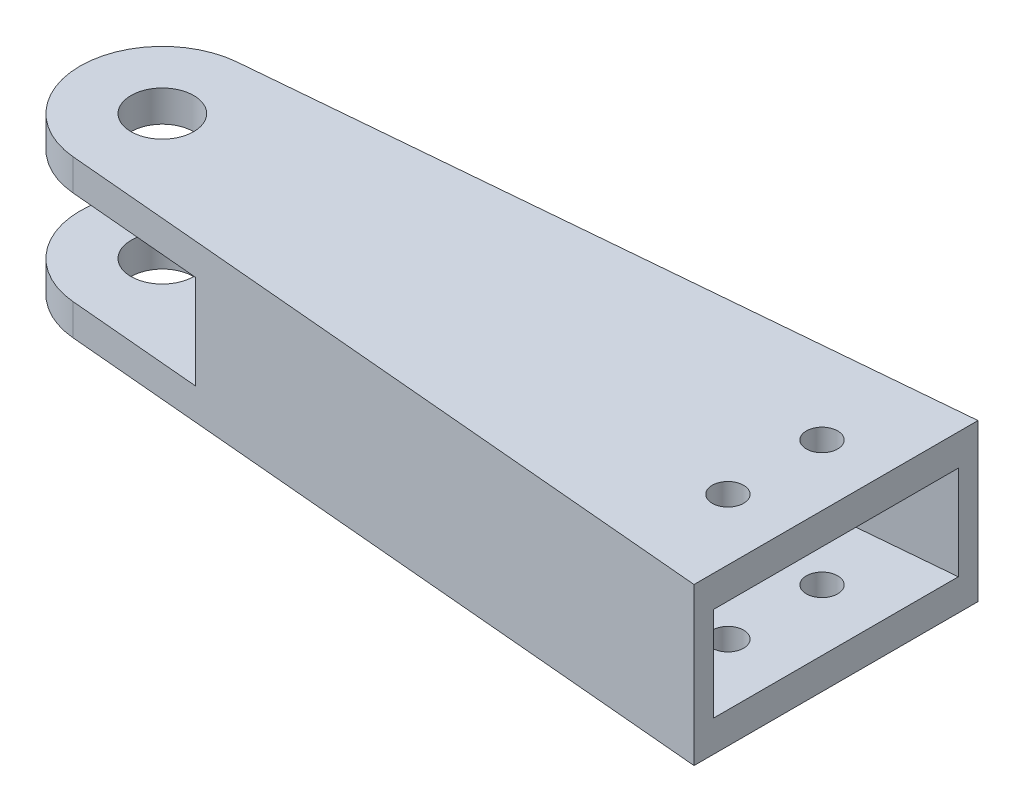
ISO-10303-21;
HEADER;
FILE_DESCRIPTION(('STEP AP214'),'2;1');
FILE_NAME('part.step','',(''),(''),'','','');
FILE_SCHEMA(('AUTOMOTIVE_DESIGN { 1 0 10303 214 1 1 1 1 }'));
ENDSEC;
DATA;
#1=APPLICATION_CONTEXT('core data for automotive mechanical design processes');
#2=APPLICATION_PROTOCOL_DEFINITION('international standard','automotive_design',2000,#1);
#3=PRODUCT_CONTEXT('',#1,'mechanical');
#4=PRODUCT('Part','Part','',(#3));
#5=PRODUCT_RELATED_PRODUCT_CATEGORY('part','',(#4));
#6=PRODUCT_DEFINITION_FORMATION('','',#4);
#7=PRODUCT_DEFINITION_CONTEXT('part definition',#1,'design');
#8=PRODUCT_DEFINITION('design','',#6,#7);
#9=PRODUCT_DEFINITION_SHAPE('','',#8);
#10=(LENGTH_UNIT() NAMED_UNIT(*) SI_UNIT(.MILLI.,.METRE.));
#11=(NAMED_UNIT(*) PLANE_ANGLE_UNIT() SI_UNIT($,.RADIAN.));
#12=(NAMED_UNIT(*) SI_UNIT($,.STERADIAN.) SOLID_ANGLE_UNIT());
#13=UNCERTAINTY_MEASURE_WITH_UNIT(LENGTH_MEASURE(1.E-05),#10,'distance_accuracy_value','');
#14=(GEOMETRIC_REPRESENTATION_CONTEXT(3) GLOBAL_UNCERTAINTY_ASSIGNED_CONTEXT((#13)) GLOBAL_UNIT_ASSIGNED_CONTEXT((#10,
#11,#12)) REPRESENTATION_CONTEXT('',''));
#15=CARTESIAN_POINT('',(0.,0.,0.));
#16=DIRECTION('',(0.,0.,1.));
#17=DIRECTION('',(1.,0.,0.));
#18=AXIS2_PLACEMENT_3D('',#15,#16,#17);
#19=CARTESIAN_POINT('',(-160.9,16.,0.));
#20=DIRECTION('',(0.,1.,0.));
#21=DIRECTION('',(0.,0.,1.));
#22=AXIS2_PLACEMENT_3D('',#19,#20,#21);
#23=PLANE('',#22);
#24=CARTESIAN_POINT('',(-160.9,16.,0.));
#25=DIRECTION('',(0.,1.,0.));
#26=DIRECTION('',(0.,0.,1.));
#27=AXIS2_PLACEMENT_3D('',#24,#25,#26);
#28=CIRCLE('',#27,3.99999999999999);
#29=CARTESIAN_POINT('',(-160.9,16.,3.99999999999999));
#30=VERTEX_POINT('',#29);
#31=EDGE_CURVE('E353',#30,#30,#28,.T.);
#32=ORIENTED_EDGE('',*,*,#31,.T.);
#33=EDGE_LOOP('',(#32));
#34=FACE_BOUND('',#33,.T.);
#35=DIRECTION('',(-0.0877327517225691,0.,-0.996144047954505));
#36=VECTOR('',#35,1.);
#37=CARTESIAN_POINT('',(-144.730083356816,16.,-11.9647668494372));
#38=LINE('',#37,#36);
#39=CARTESIAN_POINT('',(-144.510751477509,16.,-9.47440672955096));
#40=VERTEX_POINT('',#39);
#41=CARTESIAN_POINT('',(-144.730083356816,16.,-11.9647668494372));
#42=VERTEX_POINT('',#41);
#43=EDGE_CURVE('E138',#40,#42,#38,.T.);
#44=ORIENTED_EDGE('',*,*,#43,.F.);
#45=DIRECTION('',(0.,0.,-1.));
#46=VECTOR('',#45,1.);
#47=CARTESIAN_POINT('',(-144.510751477509,16.,-9.47440672955096));
#48=LINE('',#47,#46);
#49=CARTESIAN_POINT('',(-144.51075147751,16.,9.47440672955096));
#50=VERTEX_POINT('',#49);
#51=EDGE_CURVE('E156',#50,#40,#48,.T.);
#52=ORIENTED_EDGE('',*,*,#51,.F.);
#53=DIRECTION('',(0.0877327517224724,0.,-0.996144047954513));
#54=VECTOR('',#53,1.);
#55=CARTESIAN_POINT('',(-144.51075147751,16.,9.47440672955096));
#56=LINE('',#55,#54);
#57=CARTESIAN_POINT('',(-144.730083356816,16.,11.9647668494372));
#58=VERTEX_POINT('',#57);
#59=EDGE_CURVE('E251',#58,#50,#56,.T.);
#60=ORIENTED_EDGE('',*,*,#59,.F.);
#61=DIRECTION('',(0.996144047954509,0.,0.087732751722518));
#62=VECTOR('',#61,1.);
#63=CARTESIAN_POINT('',(-161.821193893087,16.,10.4595125035224));
#64=LINE('',#63,#62);
#65=CARTESIAN_POINT('',(-161.821193893087,16.,10.4595125035224));
#66=VERTEX_POINT('',#65);
#67=EDGE_CURVE('E146',#66,#58,#64,.T.);
#68=ORIENTED_EDGE('',*,*,#67,.F.);
#69=CARTESIAN_POINT('',(-160.9,16.,0.));
#70=DIRECTION('',(0.,1.,0.));
#71=DIRECTION('',(0.,0.,1.));
#72=AXIS2_PLACEMENT_3D('',#69,#70,#71);
#73=CIRCLE('',#72,10.5);
#74=CARTESIAN_POINT('',(-161.821193893087,16.,-10.4595125035224));
#75=VERTEX_POINT('',#74);
#76=EDGE_CURVE('E142',#75,#66,#73,.T.);
#77=ORIENTED_EDGE('',*,*,#76,.F.);
#78=DIRECTION('',(-0.996144047954509,0.,0.0877327517225174));
#79=VECTOR('',#78,1.);
#80=CARTESIAN_POINT('',(-75.,16.,-18.1060594700135));
#81=LINE('',#80,#79);
#82=EDGE_CURVE('E136',#42,#75,#81,.T.);
#83=ORIENTED_EDGE('',*,*,#82,.F.);
#84=EDGE_LOOP('',(#44,#52,#60,#68,#77,#83));
#85=FACE_BOUND('',#84,.T.);
#86=ADVANCED_FACE('F35',(#34,#85),#23,.F.);
#87=CARTESIAN_POINT('',(-161.821193893087,16.,10.4595125035224));
#88=DIRECTION('',(-0.087732751722518,0.,0.996144047954509));
#89=DIRECTION('',(0.996144047954509,0.,0.087732751722518));
#90=AXIS2_PLACEMENT_3D('',#87,#88,#89);
#91=PLANE('',#90);
#92=DIRECTION('',(0.996144047954509,0.,0.087732751722518));
#93=VECTOR('',#92,1.);
#94=CARTESIAN_POINT('',(-161.821193893087,20.,10.4595125035224));
#95=LINE('',#94,#93);
#96=CARTESIAN_POINT('',(-161.821193893087,20.,10.4595125035224));
#97=VERTEX_POINT('',#96);
#98=CARTESIAN_POINT('',(-75.,20.,18.1060594700135));
#99=VERTEX_POINT('',#98);
#100=EDGE_CURVE('E177',#97,#99,#95,.T.);
#101=ORIENTED_EDGE('',*,*,#100,.F.);
#102=DIRECTION('',(0.,1.,0.));
#103=VECTOR('',#102,1.);
#104=CARTESIAN_POINT('',(-161.821193893087,16.,10.4595125035224));
#105=LINE('',#104,#103);
#106=EDGE_CURVE('E11',#66,#97,#105,.T.);
#107=ORIENTED_EDGE('',*,*,#106,.F.);
#108=ORIENTED_EDGE('',*,*,#67,.T.);
#109=DIRECTION('',(0.,1.,0.));
#110=VECTOR('',#109,1.);
#111=CARTESIAN_POINT('',(-144.730083356815,4.,11.9647668494337));
#112=LINE('',#111,#110);
#113=CARTESIAN_POINT('',(-144.730083356815,4.,11.9647668494337));
#114=VERTEX_POINT('',#113);
#115=EDGE_CURVE('E174',#114,#58,#112,.T.);
#116=ORIENTED_EDGE('',*,*,#115,.F.);
#117=DIRECTION('',(-0.996144047954509,0.,-0.087732751722518));
#118=VECTOR('',#117,1.);
#119=CARTESIAN_POINT('',(-161.821193893087,3.99999999999999,10.4595125035224));
#120=LINE('',#119,#118);
#121=CARTESIAN_POINT('',(-161.821193893087,3.99999999999999,10.4595125035224));
#122=VERTEX_POINT('',#121);
#123=EDGE_CURVE('E205',#114,#122,#120,.T.);
#124=ORIENTED_EDGE('',*,*,#123,.T.);
#125=DIRECTION('',(0.,1.,0.));
#126=VECTOR('',#125,1.);
#127=CARTESIAN_POINT('',(-161.821193893087,0.,10.4595125035224));
#128=LINE('',#127,#126);
#129=CARTESIAN_POINT('',(-161.821193893087,0.,10.4595125035224));
#130=VERTEX_POINT('',#129);
#131=EDGE_CURVE('E248',#130,#122,#128,.T.);
#132=ORIENTED_EDGE('',*,*,#131,.F.);
#133=DIRECTION('',(-0.996144047954509,0.,-0.087732751722518));
#134=VECTOR('',#133,1.);
#135=CARTESIAN_POINT('',(-161.821193893087,0.,10.4595125035224));
#136=LINE('',#135,#134);
#137=CARTESIAN_POINT('',(-75.,0.,18.1060594700135));
#138=VERTEX_POINT('',#137);
#139=EDGE_CURVE('E235',#138,#130,#136,.T.);
#140=ORIENTED_EDGE('',*,*,#139,.F.);
#141=DIRECTION('',(0.,1.,0.));
#142=VECTOR('',#141,1.);
#143=CARTESIAN_POINT('',(-75.,16.,18.1060594700135));
#144=LINE('',#143,#142);
#145=EDGE_CURVE('E182',#138,#99,#144,.T.);
#146=ORIENTED_EDGE('',*,*,#145,.T.);
#147=EDGE_LOOP('',(#101,#107,#108,#116,#124,#132,#140,#146));
#148=FACE_BOUND('',#147,.T.);
#149=ADVANCED_FACE('F266',(#148),#91,.T.);
#150=CARTESIAN_POINT('',(-160.9,16.,0.));
#151=DIRECTION('',(0.,1.,0.));
#152=DIRECTION('',(0.,0.,1.));
#153=AXIS2_PLACEMENT_3D('',#150,#151,#152);
#154=CYLINDRICAL_SURFACE('',#153,10.5);
#155=CARTESIAN_POINT('',(-160.9,20.,0.));
#156=DIRECTION('',(0.,1.,0.));
#157=DIRECTION('',(0.,0.,1.));
#158=AXIS2_PLACEMENT_3D('',#155,#156,#157);
#159=CIRCLE('',#158,10.5);
#160=CARTESIAN_POINT('',(-161.821193893087,20.,-10.4595125035224));
#161=VERTEX_POINT('',#160);
#162=EDGE_CURVE('E179',#161,#97,#159,.T.);
#163=ORIENTED_EDGE('',*,*,#162,.F.);
#164=DIRECTION('',(0.,1.,0.));
#165=VECTOR('',#164,1.);
#166=CARTESIAN_POINT('',(-161.821193893087,16.,-10.4595125035224));
#167=LINE('',#166,#165);
#168=EDGE_CURVE('E45',#75,#161,#167,.T.);
#169=ORIENTED_EDGE('',*,*,#168,.F.);
#170=ORIENTED_EDGE('',*,*,#76,.T.);
#171=ORIENTED_EDGE('',*,*,#106,.T.);
#172=EDGE_LOOP('',(#163,#169,#170,#171));
#173=FACE_BOUND('',#172,.T.);
#174=ADVANCED_FACE('F270',(#173),#154,.T.);
#175=CARTESIAN_POINT('',(-75.,16.,-18.1060594700135));
#176=DIRECTION('',(-0.0877327517225175,0.,-0.996144047954509));
#177=DIRECTION('',(-0.996144047954509,0.,0.0877327517225175));
#178=AXIS2_PLACEMENT_3D('',#175,#176,#177);
#179=PLANE('',#178);
#180=DIRECTION('',(-0.996144047954509,0.,0.0877327517225174));
#181=VECTOR('',#180,1.);
#182=CARTESIAN_POINT('',(-75.,20.,-18.1060594700135));
#183=LINE('',#182,#181);
#184=CARTESIAN_POINT('',(-75.,20.,-18.1060594700135));
#185=VERTEX_POINT('',#184);
#186=EDGE_CURVE('E188',#185,#161,#183,.T.);
#187=ORIENTED_EDGE('',*,*,#186,.F.);
#188=DIRECTION('',(0.,1.,0.));
#189=VECTOR('',#188,1.);
#190=CARTESIAN_POINT('',(-75.,16.,-18.1060594700135));
#191=LINE('',#190,#189);
#192=CARTESIAN_POINT('',(-75.,0.,-18.1060594700135));
#193=VERTEX_POINT('',#192);
#194=EDGE_CURVE('E194',#193,#185,#191,.T.);
#195=ORIENTED_EDGE('',*,*,#194,.F.);
#196=DIRECTION('',(0.996144047954509,0.,-0.0877327517225174));
#197=VECTOR('',#196,1.);
#198=CARTESIAN_POINT('',(-75.,0.,-18.1060594700135));
#199=LINE('',#198,#197);
#200=CARTESIAN_POINT('',(-161.821193893087,0.,-10.4595125035224));
#201=VERTEX_POINT('',#200);
#202=EDGE_CURVE('E239',#201,#193,#199,.T.);
#203=ORIENTED_EDGE('',*,*,#202,.F.);
#204=DIRECTION('',(0.,1.,0.));
#205=VECTOR('',#204,1.);
#206=CARTESIAN_POINT('',(-161.821193893087,0.,-10.4595125035224));
#207=LINE('',#206,#205);
#208=CARTESIAN_POINT('',(-161.821193893087,3.99999999999999,-10.4595125035224));
#209=VERTEX_POINT('',#208);
#210=EDGE_CURVE('E242',#201,#209,#207,.T.);
#211=ORIENTED_EDGE('',*,*,#210,.T.);
#212=DIRECTION('',(0.996144047954509,0.,-0.0877327517225174));
#213=VECTOR('',#212,1.);
#214=CARTESIAN_POINT('',(-75.,3.99999999999999,-18.1060594700135));
#215=LINE('',#214,#213);
#216=CARTESIAN_POINT('',(-144.730083356816,3.99999999999999,-11.9647668494372));
#217=VERTEX_POINT('',#216);
#218=EDGE_CURVE('E163',#209,#217,#215,.T.);
#219=ORIENTED_EDGE('',*,*,#218,.T.);
#220=DIRECTION('',(0.,1.,0.));
#221=VECTOR('',#220,1.);
#222=CARTESIAN_POINT('',(-144.730083356816,4.,-11.9647668494372));
#223=LINE('',#222,#221);
#224=EDGE_CURVE('E152',#217,#42,#223,.T.);
#225=ORIENTED_EDGE('',*,*,#224,.T.);
#226=ORIENTED_EDGE('',*,*,#82,.T.);
#227=ORIENTED_EDGE('',*,*,#168,.T.);
#228=EDGE_LOOP('',(#187,#195,#203,#211,#219,#225,#226,#227));
#229=FACE_BOUND('',#228,.T.);
#230=ADVANCED_FACE('F160',(#229),#179,.T.);
#231=CARTESIAN_POINT('',(-75.,16.,18.1060594700135));
#232=DIRECTION('',(1.,0.,0.));
#233=DIRECTION('',(0.,0.,-1.));
#234=AXIS2_PLACEMENT_3D('',#231,#232,#233);
#235=PLANE('',#234);
#236=DIRECTION('',(0.,0.,-1.));
#237=VECTOR('',#236,1.);
#238=CARTESIAN_POINT('',(-75.,4.,15.5963822751002));
#239=LINE('',#238,#237);
#240=CARTESIAN_POINT('',(-75.,4.,15.5963822751002));
#241=VERTEX_POINT('',#240);
#242=CARTESIAN_POINT('',(-75.,4.,-15.5963822751002));
#243=VERTEX_POINT('',#242);
#244=EDGE_CURVE('E54',#241,#243,#239,.T.);
#245=ORIENTED_EDGE('',*,*,#244,.F.);
#246=DIRECTION('',(0.,-1.,0.));
#247=VECTOR('',#246,1.);
#248=CARTESIAN_POINT('',(-75.,16.,15.5963822751002));
#249=LINE('',#248,#247);
#250=CARTESIAN_POINT('',(-75.,16.,15.5963822751002));
#251=VERTEX_POINT('',#250);
#252=EDGE_CURVE('E227',#251,#241,#249,.T.);
#253=ORIENTED_EDGE('',*,*,#252,.F.);
#254=DIRECTION('',(0.,0.,1.));
#255=VECTOR('',#254,1.);
#256=CARTESIAN_POINT('',(-75.,16.,-15.5963822751002));
#257=LINE('',#256,#255);
#258=CARTESIAN_POINT('',(-75.,16.,-15.5963822751002));
#259=VERTEX_POINT('',#258);
#260=EDGE_CURVE('E217',#259,#251,#257,.T.);
#261=ORIENTED_EDGE('',*,*,#260,.F.);
#262=DIRECTION('',(0.,1.,0.));
#263=VECTOR('',#262,1.);
#264=CARTESIAN_POINT('',(-75.,4.,-15.5963822751002));
#265=LINE('',#264,#263);
#266=EDGE_CURVE('E222',#243,#259,#265,.T.);
#267=ORIENTED_EDGE('',*,*,#266,.F.);
#268=EDGE_LOOP('',(#245,#253,#261,#267));
#269=FACE_BOUND('',#268,.T.);
#270=DIRECTION('',(0.,0.,-1.));
#271=VECTOR('',#270,1.);
#272=CARTESIAN_POINT('',(-75.,20.,18.1060594700135));
#273=LINE('',#272,#271);
#274=EDGE_CURVE('E185',#99,#185,#273,.T.);
#275=ORIENTED_EDGE('',*,*,#274,.F.);
#276=ORIENTED_EDGE('',*,*,#145,.F.);
#277=DIRECTION('',(0.,0.,1.));
#278=VECTOR('',#277,1.);
#279=CARTESIAN_POINT('',(-75.,0.,18.1060594700135));
#280=LINE('',#279,#278);
#281=EDGE_CURVE('E232',#193,#138,#280,.T.);
#282=ORIENTED_EDGE('',*,*,#281,.F.);
#283=ORIENTED_EDGE('',*,*,#194,.T.);
#284=EDGE_LOOP('',(#275,#276,#282,#283));
#285=FACE_BOUND('',#284,.T.);
#286=ADVANCED_FACE('F225',(#269,#285),#235,.T.);
#287=CARTESIAN_POINT('',(-160.9,20.,0.));
#288=DIRECTION('',(0.,1.,0.));
#289=DIRECTION('',(0.,0.,1.));
#290=AXIS2_PLACEMENT_3D('',#287,#288,#289);
#291=PLANE('',#290);
#292=CARTESIAN_POINT('',(-160.9,20.,0.));
#293=DIRECTION('',(0.,1.,0.));
#294=DIRECTION('',(0.,0.,1.));
#295=AXIS2_PLACEMENT_3D('',#292,#293,#294);
#296=CIRCLE('',#295,3.99999999999998);
#297=CARTESIAN_POINT('',(-160.9,20.,3.99999999999998));
#298=VERTEX_POINT('',#297);
#299=EDGE_CURVE('E355',#298,#298,#296,.T.);
#300=ORIENTED_EDGE('',*,*,#299,.F.);
#301=EDGE_LOOP('',(#300));
#302=FACE_BOUND('',#301,.T.);
#303=CARTESIAN_POINT('',(-82.7999999999479,20.,-6.01761447089224));
#304=DIRECTION('',(0.,1.,0.));
#305=DIRECTION('',(0.,0.,1.));
#306=AXIS2_PLACEMENT_3D('',#303,#304,#305);
#307=CIRCLE('',#306,1.99999999999999);
#308=CARTESIAN_POINT('',(-82.7999999999479,20.,-4.01761447089225));
#309=VERTEX_POINT('',#308);
#310=EDGE_CURVE('E350',#309,#309,#307,.T.);
#311=ORIENTED_EDGE('',*,*,#310,.F.);
#312=EDGE_LOOP('',(#311));
#313=FACE_BOUND('',#312,.T.);
#314=CARTESIAN_POINT('',(-82.7999999999479,20.,5.98238552910776));
#315=DIRECTION('',(0.,1.,0.));
#316=DIRECTION('',(0.,0.,1.));
#317=AXIS2_PLACEMENT_3D('',#314,#315,#316);
#318=CIRCLE('',#317,1.99999999999999);
#319=CARTESIAN_POINT('',(-82.7999999999479,20.,7.98238552910775));
#320=VERTEX_POINT('',#319);
#321=EDGE_CURVE('E347',#320,#320,#318,.T.);
#322=ORIENTED_EDGE('',*,*,#321,.F.);
#323=EDGE_LOOP('',(#322));
#324=FACE_BOUND('',#323,.T.);
#325=ORIENTED_EDGE('',*,*,#100,.T.);
#326=ORIENTED_EDGE('',*,*,#274,.T.);
#327=ORIENTED_EDGE('',*,*,#186,.T.);
#328=ORIENTED_EDGE('',*,*,#162,.T.);
#329=EDGE_LOOP('',(#325,#326,#327,#328));
#330=FACE_BOUND('',#329,.T.);
#331=ADVANCED_FACE('F272',(#302,#313,#324,#330),#291,.T.);
#332=CARTESIAN_POINT('',(-144.51075147751,4.,9.47440672955096));
#333=DIRECTION('',(0.996144047954513,0.,0.0877327517224724));
#334=DIRECTION('',(0.0877327517224724,0.,-0.996144047954513));
#335=AXIS2_PLACEMENT_3D('',#332,#333,#334);
#336=PLANE('',#335);
#337=ORIENTED_EDGE('',*,*,#59,.T.);
#338=DIRECTION('',(0.,1.,0.));
#339=VECTOR('',#338,1.);
#340=CARTESIAN_POINT('',(-144.51075147751,4.,9.47440672955096));
#341=LINE('',#340,#339);
#342=CARTESIAN_POINT('',(-144.51075147751,4.,9.47440672955096));
#343=VERTEX_POINT('',#342);
#344=EDGE_CURVE('E166',#343,#50,#341,.T.);
#345=ORIENTED_EDGE('',*,*,#344,.F.);
#346=DIRECTION('',(0.0877327517224724,0.,-0.996144047954513));
#347=VECTOR('',#346,1.);
#348=CARTESIAN_POINT('',(-144.51075147751,4.,9.47440672955096));
#349=LINE('',#348,#347);
#350=EDGE_CURVE('E155',#114,#343,#349,.T.);
#351=ORIENTED_EDGE('',*,*,#350,.F.);
#352=ORIENTED_EDGE('',*,*,#115,.T.);
#353=EDGE_LOOP('',(#337,#345,#351,#352));
#354=FACE_BOUND('',#353,.T.);
#355=ADVANCED_FACE('F261',(#354),#336,.F.);
#356=CARTESIAN_POINT('',(-144.510751477509,4.,-9.47440672955096));
#357=DIRECTION('',(1.,0.,0.));
#358=DIRECTION('',(0.,0.,-1.));
#359=AXIS2_PLACEMENT_3D('',#356,#357,#358);
#360=PLANE('',#359);
#361=ORIENTED_EDGE('',*,*,#51,.T.);
#362=DIRECTION('',(0.,1.,0.));
#363=VECTOR('',#362,1.);
#364=CARTESIAN_POINT('',(-144.510751477509,4.,-9.47440672955096));
#365=LINE('',#364,#363);
#366=CARTESIAN_POINT('',(-144.510751477509,4.,-9.47440672955096));
#367=VERTEX_POINT('',#366);
#368=EDGE_CURVE('E154',#367,#40,#365,.T.);
#369=ORIENTED_EDGE('',*,*,#368,.F.);
#370=DIRECTION('',(0.,0.,-1.));
#371=VECTOR('',#370,1.);
#372=CARTESIAN_POINT('',(-144.510751477509,4.,-9.47440672955096));
#373=LINE('',#372,#371);
#374=EDGE_CURVE('E168',#343,#367,#373,.T.);
#375=ORIENTED_EDGE('',*,*,#374,.F.);
#376=ORIENTED_EDGE('',*,*,#344,.T.);
#377=EDGE_LOOP('',(#361,#369,#375,#376));
#378=FACE_BOUND('',#377,.T.);
#379=ADVANCED_FACE('F258',(#378),#360,.F.);
#380=CARTESIAN_POINT('',(-144.730083356816,4.,-11.9647668494372));
#381=DIRECTION('',(0.996144047954505,0.,-0.087732751722569));
#382=DIRECTION('',(-0.087732751722569,0.,-0.996144047954505));
#383=AXIS2_PLACEMENT_3D('',#380,#381,#382);
#384=PLANE('',#383);
#385=ORIENTED_EDGE('',*,*,#43,.T.);
#386=ORIENTED_EDGE('',*,*,#224,.F.);
#387=DIRECTION('',(-0.0877327517225691,0.,-0.996144047954505));
#388=VECTOR('',#387,1.);
#389=CARTESIAN_POINT('',(-144.730083356816,4.,-11.9647668494372));
#390=LINE('',#389,#388);
#391=EDGE_CURVE('E164',#367,#217,#390,.T.);
#392=ORIENTED_EDGE('',*,*,#391,.F.);
#393=ORIENTED_EDGE('',*,*,#368,.T.);
#394=EDGE_LOOP('',(#385,#386,#392,#393));
#395=FACE_BOUND('',#394,.T.);
#396=ADVANCED_FACE('F150',(#395),#384,.F.);
#397=CARTESIAN_POINT('',(-160.9,0.,0.));
#398=DIRECTION('',(0.,1.,0.));
#399=DIRECTION('',(0.,0.,1.));
#400=AXIS2_PLACEMENT_3D('',#397,#398,#399);
#401=CYLINDRICAL_SURFACE('',#400,10.5);
#402=CARTESIAN_POINT('',(-160.9,3.99999999999999,0.));
#403=DIRECTION('',(0.,-1.,0.));
#404=DIRECTION('',(0.,0.,1.));
#405=AXIS2_PLACEMENT_3D('',#402,#403,#404);
#406=CIRCLE('',#405,10.5);
#407=EDGE_CURVE('E244',#122,#209,#406,.T.);
#408=ORIENTED_EDGE('',*,*,#407,.T.);
#409=ORIENTED_EDGE('',*,*,#210,.F.);
#410=CARTESIAN_POINT('',(-160.9,0.,0.));
#411=DIRECTION('',(0.,-1.,0.));
#412=DIRECTION('',(0.,0.,1.));
#413=AXIS2_PLACEMENT_3D('',#410,#411,#412);
#414=CIRCLE('',#413,10.5);
#415=EDGE_CURVE('E237',#130,#201,#414,.T.);
#416=ORIENTED_EDGE('',*,*,#415,.F.);
#417=ORIENTED_EDGE('',*,*,#131,.T.);
#418=EDGE_LOOP('',(#408,#409,#416,#417));
#419=FACE_BOUND('',#418,.T.);
#420=ADVANCED_FACE('F282',(#419),#401,.T.);
#421=CARTESIAN_POINT('',(-160.9,0.,0.));
#422=DIRECTION('',(0.,1.,0.));
#423=DIRECTION('',(0.,0.,1.));
#424=AXIS2_PLACEMENT_3D('',#421,#422,#423);
#425=PLANE('',#424);
#426=CARTESIAN_POINT('',(-160.9,0.,0.));
#427=DIRECTION('',(0.,1.,0.));
#428=DIRECTION('',(0.,0.,1.));
#429=AXIS2_PLACEMENT_3D('',#426,#427,#428);
#430=CIRCLE('',#429,3.99999999999998);
#431=CARTESIAN_POINT('',(-160.9,0.,3.99999999999998));
#432=VERTEX_POINT('',#431);
#433=EDGE_CURVE('E358',#432,#432,#430,.T.);
#434=ORIENTED_EDGE('',*,*,#433,.T.);
#435=EDGE_LOOP('',(#434));
#436=FACE_BOUND('',#435,.T.);
#437=CARTESIAN_POINT('',(-82.7999999999479,0.,-6.01761447089224));
#438=DIRECTION('',(0.,1.,0.));
#439=DIRECTION('',(0.,0.,1.));
#440=AXIS2_PLACEMENT_3D('',#437,#438,#439);
#441=CIRCLE('',#440,1.99999999999999);
#442=CARTESIAN_POINT('',(-82.7999999999479,0.,-4.01761447089225));
#443=VERTEX_POINT('',#442);
#444=EDGE_CURVE('E338',#443,#443,#441,.T.);
#445=ORIENTED_EDGE('',*,*,#444,.T.);
#446=EDGE_LOOP('',(#445));
#447=FACE_BOUND('',#446,.T.);
#448=CARTESIAN_POINT('',(-82.7999999999479,0.,5.98238552910776));
#449=DIRECTION('',(0.,1.,0.));
#450=DIRECTION('',(0.,0.,1.));
#451=AXIS2_PLACEMENT_3D('',#448,#449,#450);
#452=CIRCLE('',#451,1.99999999999999);
#453=CARTESIAN_POINT('',(-82.7999999999479,0.,7.98238552910775));
#454=VERTEX_POINT('',#453);
#455=EDGE_CURVE('E328',#454,#454,#452,.T.);
#456=ORIENTED_EDGE('',*,*,#455,.T.);
#457=EDGE_LOOP('',(#456));
#458=FACE_BOUND('',#457,.T.);
#459=ORIENTED_EDGE('',*,*,#281,.T.);
#460=ORIENTED_EDGE('',*,*,#139,.T.);
#461=ORIENTED_EDGE('',*,*,#415,.T.);
#462=ORIENTED_EDGE('',*,*,#202,.T.);
#463=EDGE_LOOP('',(#459,#460,#461,#462));
#464=FACE_BOUND('',#463,.T.);
#465=ADVANCED_FACE('F278',(#436,#447,#458,#464),#425,.F.);
#466=CARTESIAN_POINT('',(-160.9,3.99999999999999,0.));
#467=DIRECTION('',(0.,1.,0.));
#468=DIRECTION('',(0.,0.,1.));
#469=AXIS2_PLACEMENT_3D('',#466,#467,#468);
#470=PLANE('',#469);
#471=CARTESIAN_POINT('',(-160.9,3.99999999999999,0.));
#472=DIRECTION('',(0.,1.,0.));
#473=DIRECTION('',(0.,0.,1.));
#474=AXIS2_PLACEMENT_3D('',#471,#472,#473);
#475=CIRCLE('',#474,3.99999999999998);
#476=CARTESIAN_POINT('',(-160.9,3.99999999999999,3.99999999999998));
#477=VERTEX_POINT('',#476);
#478=EDGE_CURVE('E361',#477,#477,#475,.T.);
#479=ORIENTED_EDGE('',*,*,#478,.F.);
#480=EDGE_LOOP('',(#479));
#481=FACE_BOUND('',#480,.T.);
#482=ORIENTED_EDGE('',*,*,#123,.F.);
#483=ORIENTED_EDGE('',*,*,#350,.T.);
#484=ORIENTED_EDGE('',*,*,#374,.T.);
#485=ORIENTED_EDGE('',*,*,#391,.T.);
#486=ORIENTED_EDGE('',*,*,#218,.F.);
#487=ORIENTED_EDGE('',*,*,#407,.F.);
#488=EDGE_LOOP('',(#482,#483,#484,#485,#486,#487));
#489=FACE_BOUND('',#488,.T.);
#490=ADVANCED_FACE('F285',(#481,#489),#470,.T.);
#491=CARTESIAN_POINT('',(-95.,4.,15.5963822751002));
#492=DIRECTION('',(0.,-1.,0.));
#493=DIRECTION('',(0.,0.,-1.));
#494=AXIS2_PLACEMENT_3D('',#491,#492,#493);
#495=PLANE('',#494);
#496=CARTESIAN_POINT('',(-82.7999999999479,4.,-6.01761447089224));
#497=DIRECTION('',(0.,1.,0.));
#498=DIRECTION('',(0.,0.,1.));
#499=AXIS2_PLACEMENT_3D('',#496,#497,#498);
#500=CIRCLE('',#499,1.99999999999999);
#501=CARTESIAN_POINT('',(-82.7999999999479,4.,-4.01761447089225));
#502=VERTEX_POINT('',#501);
#503=EDGE_CURVE('E341',#502,#502,#500,.T.);
#504=ORIENTED_EDGE('',*,*,#503,.F.);
#505=EDGE_LOOP('',(#504));
#506=FACE_BOUND('',#505,.T.);
#507=CARTESIAN_POINT('',(-82.7999999999479,4.,5.98238552910776));
#508=DIRECTION('',(0.,1.,0.));
#509=DIRECTION('',(0.,0.,1.));
#510=AXIS2_PLACEMENT_3D('',#507,#508,#509);
#511=CIRCLE('',#510,1.99999999999999);
#512=CARTESIAN_POINT('',(-82.7999999999479,4.,7.98238552910775));
#513=VERTEX_POINT('',#512);
#514=EDGE_CURVE('E330',#513,#513,#511,.T.);
#515=ORIENTED_EDGE('',*,*,#514,.F.);
#516=EDGE_LOOP('',(#515));
#517=FACE_BOUND('',#516,.T.);
#518=ORIENTED_EDGE('',*,*,#244,.T.);
#519=DIRECTION('',(-0.996144047954509,0.,0.0877327517225213));
#520=VECTOR('',#519,1.);
#521=CARTESIAN_POINT('',(-97.5721340505858,4.,-13.6084012832207));
#522=LINE('',#521,#520);
#523=CARTESIAN_POINT('',(-95.,4.,-13.8349351851402));
#524=VERTEX_POINT('',#523);
#525=EDGE_CURVE('E70',#524,#243,#522,.F.);
#526=ORIENTED_EDGE('',*,*,#525,.F.);
#527=DIRECTION('',(0.,0.,-1.));
#528=VECTOR('',#527,1.);
#529=CARTESIAN_POINT('',(-95.,4.,15.5963822751002));
#530=LINE('',#529,#528);
#531=CARTESIAN_POINT('',(-95.,4.,13.8349351851402));
#532=VERTEX_POINT('',#531);
#533=EDGE_CURVE('E209',#532,#524,#530,.T.);
#534=ORIENTED_EDGE('',*,*,#533,.F.);
#535=DIRECTION('',(-0.996144047954509,0.,-0.0877327517225213));
#536=VECTOR('',#535,1.);
#537=CARTESIAN_POINT('',(-75.,4.,15.5963822751002));
#538=LINE('',#537,#536);
#539=EDGE_CURVE('E75',#532,#241,#538,.F.);
#540=ORIENTED_EDGE('',*,*,#539,.T.);
#541=EDGE_LOOP('',(#518,#526,#534,#540));
#542=FACE_BOUND('',#541,.T.);
#543=ADVANCED_FACE('F287',(#506,#517,#542),#495,.F.);
#544=CARTESIAN_POINT('',(-75.,16.,15.5963822751002));
#545=DIRECTION('',(0.0877327517225213,0.,-0.996144047954509));
#546=DIRECTION('',(-0.996144047954509,0.,-0.0877327517225213));
#547=AXIS2_PLACEMENT_3D('',#544,#545,#546);
#548=PLANE('',#547);
#549=ORIENTED_EDGE('',*,*,#252,.T.);
#550=ORIENTED_EDGE('',*,*,#539,.F.);
#551=DIRECTION('',(0.,1.,0.));
#552=VECTOR('',#551,1.);
#553=CARTESIAN_POINT('',(-95.,0.,13.8349351851402));
#554=LINE('',#553,#552);
#555=CARTESIAN_POINT('',(-95.,16.,13.8349351851402));
#556=VERTEX_POINT('',#555);
#557=EDGE_CURVE('E200',#556,#532,#554,.F.);
#558=ORIENTED_EDGE('',*,*,#557,.F.);
#559=DIRECTION('',(-0.996144047954509,0.,-0.0877327517225213));
#560=VECTOR('',#559,1.);
#561=CARTESIAN_POINT('',(-97.5721340505858,16.,13.6084012832207));
#562=LINE('',#561,#560);
#563=EDGE_CURVE('E197',#556,#251,#562,.F.);
#564=ORIENTED_EDGE('',*,*,#563,.T.);
#565=EDGE_LOOP('',(#549,#550,#558,#564));
#566=FACE_BOUND('',#565,.T.);
#567=ADVANCED_FACE('F294',(#566),#548,.T.);
#568=CARTESIAN_POINT('',(-95.,16.,-15.5963822751002));
#569=DIRECTION('',(0.,1.,0.));
#570=DIRECTION('',(0.,0.,1.));
#571=AXIS2_PLACEMENT_3D('',#568,#569,#570);
#572=PLANE('',#571);
#573=CARTESIAN_POINT('',(-82.7999999999479,16.,-6.01761447089224));
#574=DIRECTION('',(0.,1.,0.));
#575=DIRECTION('',(0.,0.,1.));
#576=AXIS2_PLACEMENT_3D('',#573,#574,#575);
#577=CIRCLE('',#576,1.99999999999999);
#578=CARTESIAN_POINT('',(-82.7999999999479,16.,-4.01761447089225));
#579=VERTEX_POINT('',#578);
#580=EDGE_CURVE('E39',#579,#579,#577,.T.);
#581=ORIENTED_EDGE('',*,*,#580,.T.);
#582=EDGE_LOOP('',(#581));
#583=FACE_BOUND('',#582,.T.);
#584=CARTESIAN_POINT('',(-82.7999999999479,16.,5.98238552910776));
#585=DIRECTION('',(0.,1.,0.));
#586=DIRECTION('',(0.,0.,1.));
#587=AXIS2_PLACEMENT_3D('',#584,#585,#586);
#588=CIRCLE('',#587,1.99999999999999);
#589=CARTESIAN_POINT('',(-82.7999999999479,16.,7.98238552910775));
#590=VERTEX_POINT('',#589);
#591=EDGE_CURVE('E344',#590,#590,#588,.T.);
#592=ORIENTED_EDGE('',*,*,#591,.T.);
#593=EDGE_LOOP('',(#592));
#594=FACE_BOUND('',#593,.T.);
#595=ORIENTED_EDGE('',*,*,#260,.T.);
#596=ORIENTED_EDGE('',*,*,#563,.F.);
#597=DIRECTION('',(0.,0.,1.));
#598=VECTOR('',#597,1.);
#599=CARTESIAN_POINT('',(-95.,16.,-15.5963822751002));
#600=LINE('',#599,#598);
#601=CARTESIAN_POINT('',(-95.,16.,-13.8349351851402));
#602=VERTEX_POINT('',#601);
#603=EDGE_CURVE('E203',#602,#556,#600,.T.);
#604=ORIENTED_EDGE('',*,*,#603,.F.);
#605=DIRECTION('',(-0.996144047954509,0.,0.0877327517225213));
#606=VECTOR('',#605,1.);
#607=CARTESIAN_POINT('',(-75.,16.,-15.5963822751002));
#608=LINE('',#607,#606);
#609=EDGE_CURVE('E199',#602,#259,#608,.F.);
#610=ORIENTED_EDGE('',*,*,#609,.T.);
#611=EDGE_LOOP('',(#595,#596,#604,#610));
#612=FACE_BOUND('',#611,.T.);
#613=ADVANCED_FACE('F215',(#583,#594,#612),#572,.F.);
#614=CARTESIAN_POINT('',(-75.,4.,-15.5963822751002));
#615=DIRECTION('',(0.0877327517225213,0.,0.996144047954509));
#616=DIRECTION('',(0.996144047954509,0.,-0.0877327517225213));
#617=AXIS2_PLACEMENT_3D('',#614,#615,#616);
#618=PLANE('',#617);
#619=ORIENTED_EDGE('',*,*,#266,.T.);
#620=ORIENTED_EDGE('',*,*,#609,.F.);
#621=DIRECTION('',(0.,-1.,0.));
#622=VECTOR('',#621,1.);
#623=CARTESIAN_POINT('',(-95.,0.,-13.8349351851402));
#624=LINE('',#623,#622);
#625=EDGE_CURVE('E207',#524,#602,#624,.F.);
#626=ORIENTED_EDGE('',*,*,#625,.F.);
#627=ORIENTED_EDGE('',*,*,#525,.T.);
#628=EDGE_LOOP('',(#619,#620,#626,#627));
#629=FACE_BOUND('',#628,.T.);
#630=ADVANCED_FACE('F37',(#629),#618,.T.);
#631=CARTESIAN_POINT('',(-95.,0.,0.));
#632=DIRECTION('',(1.,0.,0.));
#633=DIRECTION('',(0.,0.,-1.));
#634=AXIS2_PLACEMENT_3D('',#631,#632,#633);
#635=PLANE('',#634);
#636=ORIENTED_EDGE('',*,*,#533,.T.);
#637=ORIENTED_EDGE('',*,*,#625,.T.);
#638=ORIENTED_EDGE('',*,*,#603,.T.);
#639=ORIENTED_EDGE('',*,*,#557,.T.);
#640=EDGE_LOOP('',(#636,#637,#638,#639));
#641=FACE_BOUND('',#640,.T.);
#642=ADVANCED_FACE('F391',(#641),#635,.T.);
#643=CARTESIAN_POINT('',(-82.7999999999479,4.,5.98238552910776));
#644=DIRECTION('',(0.,1.,0.));
#645=DIRECTION('',(0.,0.,1.));
#646=AXIS2_PLACEMENT_3D('',#643,#644,#645);
#647=CYLINDRICAL_SURFACE('',#646,1.99999999999999);
#648=ORIENTED_EDGE('',*,*,#455,.F.);
#649=EDGE_LOOP('',(#648));
#650=FACE_BOUND('',#649,.T.);
#651=ORIENTED_EDGE('',*,*,#514,.T.);
#652=EDGE_LOOP('',(#651));
#653=FACE_BOUND('',#652,.T.);
#654=ADVANCED_FACE('F387',(#650,#653),#647,.F.);
#655=CARTESIAN_POINT('',(-82.7999999999479,4.,-6.01761447089224));
#656=DIRECTION('',(0.,1.,0.));
#657=DIRECTION('',(0.,0.,1.));
#658=AXIS2_PLACEMENT_3D('',#655,#656,#657);
#659=CYLINDRICAL_SURFACE('',#658,1.99999999999999);
#660=ORIENTED_EDGE('',*,*,#444,.F.);
#661=EDGE_LOOP('',(#660));
#662=FACE_BOUND('',#661,.T.);
#663=ORIENTED_EDGE('',*,*,#503,.T.);
#664=EDGE_LOOP('',(#663));
#665=FACE_BOUND('',#664,.T.);
#666=ADVANCED_FACE('F383',(#662,#665),#659,.F.);
#667=CARTESIAN_POINT('',(-82.7999999999479,20.,5.98238552910776));
#668=DIRECTION('',(0.,1.,0.));
#669=DIRECTION('',(0.,0.,1.));
#670=AXIS2_PLACEMENT_3D('',#667,#668,#669);
#671=CYLINDRICAL_SURFACE('',#670,1.99999999999999);
#672=ORIENTED_EDGE('',*,*,#321,.T.);
#673=EDGE_LOOP('',(#672));
#674=FACE_BOUND('',#673,.T.);
#675=ORIENTED_EDGE('',*,*,#591,.F.);
#676=EDGE_LOOP('',(#675));
#677=FACE_BOUND('',#676,.T.);
#678=ADVANCED_FACE('F379',(#674,#677),#671,.F.);
#679=CARTESIAN_POINT('',(-82.7999999999479,20.,-6.01761447089224));
#680=DIRECTION('',(0.,1.,0.));
#681=DIRECTION('',(0.,0.,1.));
#682=AXIS2_PLACEMENT_3D('',#679,#680,#681);
#683=CYLINDRICAL_SURFACE('',#682,1.99999999999999);
#684=ORIENTED_EDGE('',*,*,#310,.T.);
#685=EDGE_LOOP('',(#684));
#686=FACE_BOUND('',#685,.T.);
#687=ORIENTED_EDGE('',*,*,#580,.F.);
#688=EDGE_LOOP('',(#687));
#689=FACE_BOUND('',#688,.T.);
#690=ADVANCED_FACE('F372',(#686,#689),#683,.F.);
#691=CARTESIAN_POINT('',(-160.9,20.,0.));
#692=DIRECTION('',(0.,1.,0.));
#693=DIRECTION('',(0.,0.,1.));
#694=AXIS2_PLACEMENT_3D('',#691,#692,#693);
#695=CYLINDRICAL_SURFACE('',#694,3.99999999999999);
#696=ORIENTED_EDGE('',*,*,#31,.F.);
#697=EDGE_LOOP('',(#696));
#698=FACE_BOUND('',#697,.T.);
#699=ORIENTED_EDGE('',*,*,#299,.T.);
#700=EDGE_LOOP('',(#699));
#701=FACE_BOUND('',#700,.T.);
#702=ADVANCED_FACE('F366',(#698,#701),#695,.F.);
#703=CARTESIAN_POINT('',(-160.9,3.99999999999999,0.));
#704=DIRECTION('',(0.,1.,0.));
#705=DIRECTION('',(0.,0.,1.));
#706=AXIS2_PLACEMENT_3D('',#703,#704,#705);
#707=CYLINDRICAL_SURFACE('',#706,3.99999999999998);
#708=ORIENTED_EDGE('',*,*,#433,.F.);
#709=EDGE_LOOP('',(#708));
#710=FACE_BOUND('',#709,.T.);
#711=ORIENTED_EDGE('',*,*,#478,.T.);
#712=EDGE_LOOP('',(#711));
#713=FACE_BOUND('',#712,.T.);
#714=ADVANCED_FACE('F364',(#710,#713),#707,.F.);
#715=CLOSED_SHELL('',(#86,#149,#174,#230,#286,#331,#355,#379,#396,#420,#465,#490,#543,#567,#613,
#630,#642,#654,#666,#678,#690,#702,#714));
#716=MANIFOLD_SOLID_BREP('B2',#715);
#717=ADVANCED_BREP_SHAPE_REPRESENTATION('',(#18,#716),#14);
#718=SHAPE_DEFINITION_REPRESENTATION(#9,#717);
ENDSEC;
END-ISO-10303-21;
